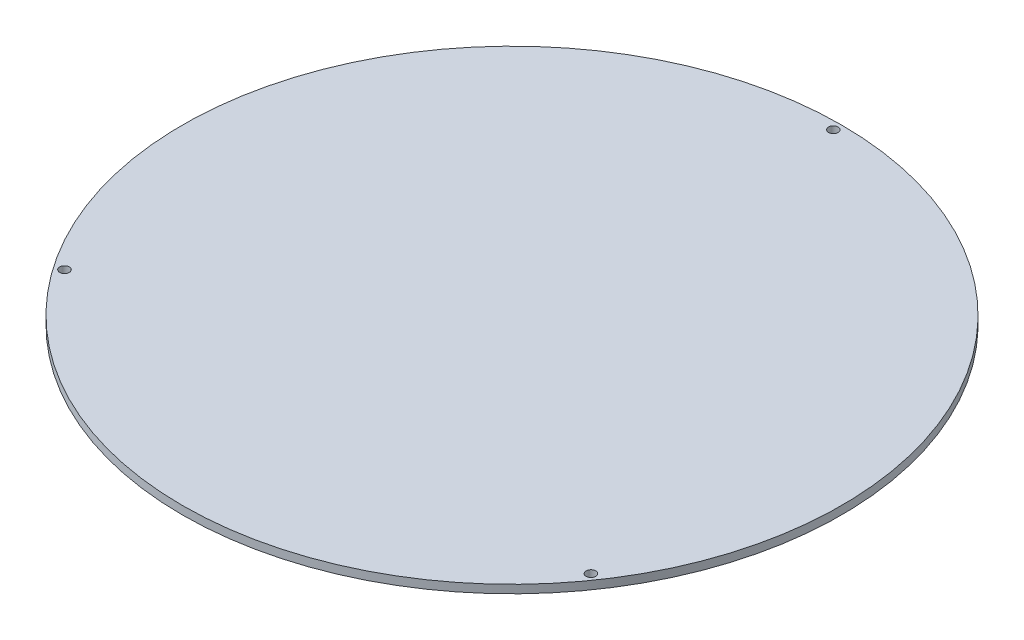
ISO-10303-21;
HEADER;
FILE_DESCRIPTION(('STEP AP214'),'2;1');
FILE_NAME('part.step','',(''),(''),'','','');
FILE_SCHEMA(('AUTOMOTIVE_DESIGN { 1 0 10303 214 1 1 1 1 }'));
ENDSEC;
DATA;
#1=APPLICATION_CONTEXT('core data for automotive mechanical design processes');
#2=APPLICATION_PROTOCOL_DEFINITION('international standard','automotive_design',2000,#1);
#3=PRODUCT_CONTEXT('',#1,'mechanical');
#4=PRODUCT('Part','Part','',(#3));
#5=PRODUCT_RELATED_PRODUCT_CATEGORY('part','',(#4));
#6=PRODUCT_DEFINITION_FORMATION('','',#4);
#7=PRODUCT_DEFINITION_CONTEXT('part definition',#1,'design');
#8=PRODUCT_DEFINITION('design','',#6,#7);
#9=PRODUCT_DEFINITION_SHAPE('','',#8);
#10=(LENGTH_UNIT() NAMED_UNIT(*) SI_UNIT(.MILLI.,.METRE.));
#11=(NAMED_UNIT(*) PLANE_ANGLE_UNIT() SI_UNIT($,.RADIAN.));
#12=(NAMED_UNIT(*) SI_UNIT($,.STERADIAN.) SOLID_ANGLE_UNIT());
#13=UNCERTAINTY_MEASURE_WITH_UNIT(LENGTH_MEASURE(1.E-05),#10,'distance_accuracy_value','');
#14=(GEOMETRIC_REPRESENTATION_CONTEXT(3) GLOBAL_UNCERTAINTY_ASSIGNED_CONTEXT((#13)) GLOBAL_UNIT_ASSIGNED_CONTEXT((#10,
#11,#12)) REPRESENTATION_CONTEXT('',''));
#15=CARTESIAN_POINT('',(0.,0.,0.));
#16=DIRECTION('',(0.,0.,1.));
#17=DIRECTION('',(1.,0.,0.));
#18=AXIS2_PLACEMENT_3D('',#15,#16,#17);
#19=CARTESIAN_POINT('',(0.,3.,0.));
#20=DIRECTION('',(0.,-1.,0.));
#21=DIRECTION('',(0.,0.,-1.));
#22=AXIS2_PLACEMENT_3D('',#19,#20,#21);
#23=CYLINDRICAL_SURFACE('',#22,120.);
#24=CARTESIAN_POINT('',(0.,3.,0.));
#25=DIRECTION('',(0.,1.,0.));
#26=DIRECTION('',(0.,0.,1.));
#27=AXIS2_PLACEMENT_3D('',#24,#25,#26);
#28=CIRCLE('',#27,120.);
#29=CARTESIAN_POINT('',(0.,3.,120.));
#30=VERTEX_POINT('',#29);
#31=EDGE_CURVE('E10',#30,#30,#28,.T.);
#32=ORIENTED_EDGE('',*,*,#31,.F.);
#33=EDGE_LOOP('',(#32));
#34=FACE_BOUND('',#33,.T.);
#35=CARTESIAN_POINT('',(0.,0.,0.));
#36=DIRECTION('',(0.,1.,0.));
#37=DIRECTION('',(0.,0.,1.));
#38=AXIS2_PLACEMENT_3D('',#35,#36,#37);
#39=CIRCLE('',#38,120.);
#40=CARTESIAN_POINT('',(0.,0.,120.));
#41=VERTEX_POINT('',#40);
#42=EDGE_CURVE('E38',#41,#41,#39,.T.);
#43=ORIENTED_EDGE('',*,*,#42,.T.);
#44=EDGE_LOOP('',(#43));
#45=FACE_BOUND('',#44,.T.);
#46=ADVANCED_FACE('F31',(#34,#45),#23,.T.);
#47=CARTESIAN_POINT('',(0.,3.,0.));
#48=DIRECTION('',(0.,1.,0.));
#49=DIRECTION('',(0.,0.,1.));
#50=AXIS2_PLACEMENT_3D('',#47,#48,#49);
#51=PLANE('',#50);
#52=CARTESIAN_POINT('',(0.,3.,-117.));
#53=DIRECTION('',(0.,1.,0.));
#54=DIRECTION('',(0.,0.,1.));
#55=AXIS2_PLACEMENT_3D('',#52,#53,#54);
#56=CIRCLE('',#55,1.75);
#57=CARTESIAN_POINT('',(0.,3.,-115.25));
#58=VERTEX_POINT('',#57);
#59=EDGE_CURVE('E51',#58,#58,#56,.T.);
#60=ORIENTED_EDGE('',*,*,#59,.F.);
#61=EDGE_LOOP('',(#60));
#62=FACE_BOUND('',#61,.T.);
#63=CARTESIAN_POINT('',(-95.8407891818117,3.,67.1084430530729));
#64=DIRECTION('',(0.,1.,0.));
#65=DIRECTION('',(0.,0.,1.));
#66=AXIS2_PLACEMENT_3D('',#63,#64,#65);
#67=CIRCLE('',#66,1.75);
#68=CARTESIAN_POINT('',(-95.8407891818117,3.,68.8584430530729));
#69=VERTEX_POINT('',#68);
#70=EDGE_CURVE('E98',#69,#69,#67,.T.);
#71=ORIENTED_EDGE('',*,*,#70,.F.);
#72=EDGE_LOOP('',(#71));
#73=FACE_BOUND('',#72,.T.);
#74=CARTESIAN_POINT('',(95.8407891818117,3.,67.1084430530729));
#75=DIRECTION('',(0.,1.,0.));
#76=DIRECTION('',(0.,0.,1.));
#77=AXIS2_PLACEMENT_3D('',#74,#75,#76);
#78=CIRCLE('',#77,1.75);
#79=CARTESIAN_POINT('',(95.8407891818117,3.,68.8584430530729));
#80=VERTEX_POINT('',#79);
#81=EDGE_CURVE('E45',#80,#80,#78,.T.);
#82=ORIENTED_EDGE('',*,*,#81,.F.);
#83=EDGE_LOOP('',(#82));
#84=FACE_BOUND('',#83,.T.);
#85=ORIENTED_EDGE('',*,*,#31,.T.);
#86=EDGE_LOOP('',(#85));
#87=FACE_BOUND('',#86,.T.);
#88=ADVANCED_FACE('F73',(#62,#73,#84,#87),#51,.T.);
#89=CARTESIAN_POINT('',(0.,0.,0.));
#90=DIRECTION('',(0.,1.,0.));
#91=DIRECTION('',(0.,0.,1.));
#92=AXIS2_PLACEMENT_3D('',#89,#90,#91);
#93=PLANE('',#92);
#94=CARTESIAN_POINT('',(0.,0.,-117.));
#95=DIRECTION('',(0.,1.,0.));
#96=DIRECTION('',(0.,0.,1.));
#97=AXIS2_PLACEMENT_3D('',#94,#95,#96);
#98=CIRCLE('',#97,1.75);
#99=CARTESIAN_POINT('',(0.,0.,-115.25));
#100=VERTEX_POINT('',#99);
#101=EDGE_CURVE('E34',#100,#100,#98,.T.);
#102=ORIENTED_EDGE('',*,*,#101,.T.);
#103=EDGE_LOOP('',(#102));
#104=FACE_BOUND('',#103,.T.);
#105=CARTESIAN_POINT('',(-95.8407891818117,0.,67.1084430530729));
#106=DIRECTION('',(0.,1.,0.));
#107=DIRECTION('',(0.,0.,1.));
#108=AXIS2_PLACEMENT_3D('',#105,#106,#107);
#109=CIRCLE('',#108,1.75);
#110=CARTESIAN_POINT('',(-95.8407891818117,0.,68.8584430530729));
#111=VERTEX_POINT('',#110);
#112=EDGE_CURVE('E50',#111,#111,#109,.T.);
#113=ORIENTED_EDGE('',*,*,#112,.T.);
#114=EDGE_LOOP('',(#113));
#115=FACE_BOUND('',#114,.T.);
#116=CARTESIAN_POINT('',(95.8407891818117,0.,67.1084430530729));
#117=DIRECTION('',(0.,1.,0.));
#118=DIRECTION('',(0.,0.,1.));
#119=AXIS2_PLACEMENT_3D('',#116,#117,#118);
#120=CIRCLE('',#119,1.75);
#121=CARTESIAN_POINT('',(95.8407891818117,0.,68.8584430530729));
#122=VERTEX_POINT('',#121);
#123=EDGE_CURVE('E48',#122,#122,#120,.T.);
#124=ORIENTED_EDGE('',*,*,#123,.T.);
#125=EDGE_LOOP('',(#124));
#126=FACE_BOUND('',#125,.T.);
#127=ORIENTED_EDGE('',*,*,#42,.F.);
#128=EDGE_LOOP('',(#127));
#129=FACE_BOUND('',#128,.T.);
#130=ADVANCED_FACE('F58',(#104,#115,#126,#129),#93,.F.);
#131=CARTESIAN_POINT('',(95.8407891818117,-1.2E-05,67.1084430530729));
#132=DIRECTION('',(0.,1.,0.));
#133=DIRECTION('',(0.,0.,1.));
#134=AXIS2_PLACEMENT_3D('',#131,#132,#133);
#135=CYLINDRICAL_SURFACE('',#134,1.75);
#136=CARTESIAN_POINT('',(95.8407891818117,3.,68.8584430530729));
#137=CARTESIAN_POINT('',(95.8407891818117,2.96875,68.8584430530729));
#138=CARTESIAN_POINT('',(95.8407891818117,2.9375,68.8584430530729));
#139=CARTESIAN_POINT('',(95.8407891818117,2.875,68.8584430530729));
#140=CARTESIAN_POINT('',(95.8407891818117,2.84375,68.8584430530729));
#141=CARTESIAN_POINT('',(95.8407891818117,2.78125,68.8584430530729));
#142=CARTESIAN_POINT('',(95.8407891818117,2.75,68.8584430530729));
#143=CARTESIAN_POINT('',(95.8407891818117,2.6875,68.8584430530729));
#144=CARTESIAN_POINT('',(95.8407891818117,2.65625,68.8584430530729));
#145=CARTESIAN_POINT('',(95.8407891818117,2.59375,68.8584430530729));
#146=CARTESIAN_POINT('',(95.8407891818117,2.5625,68.8584430530729));
#147=CARTESIAN_POINT('',(95.8407891818117,2.5,68.8584430530729));
#148=CARTESIAN_POINT('',(95.8407891818117,2.46875,68.8584430530729));
#149=CARTESIAN_POINT('',(95.8407891818117,2.40625,68.8584430530729));
#150=CARTESIAN_POINT('',(95.8407891818117,2.375,68.8584430530729));
#151=CARTESIAN_POINT('',(95.8407891818117,2.3125,68.8584430530729));
#152=CARTESIAN_POINT('',(95.8407891818117,2.28125,68.8584430530729));
#153=CARTESIAN_POINT('',(95.8407891818117,2.21875,68.8584430530729));
#154=CARTESIAN_POINT('',(95.8407891818117,2.1875,68.8584430530729));
#155=CARTESIAN_POINT('',(95.8407891818117,2.125,68.8584430530729));
#156=CARTESIAN_POINT('',(95.8407891818117,2.09375,68.8584430530729));
#157=CARTESIAN_POINT('',(95.8407891818117,2.03125,68.8584430530729));
#158=CARTESIAN_POINT('',(95.8407891818117,2.,68.8584430530729));
#159=CARTESIAN_POINT('',(95.8407891818117,1.9375,68.8584430530729));
#160=CARTESIAN_POINT('',(95.8407891818117,1.90625,68.8584430530729));
#161=CARTESIAN_POINT('',(95.8407891818117,1.84375,68.8584430530729));
#162=CARTESIAN_POINT('',(95.8407891818117,1.8125,68.8584430530729));
#163=CARTESIAN_POINT('',(95.8407891818117,1.75,68.8584430530729));
#164=CARTESIAN_POINT('',(95.8407891818117,1.71875,68.8584430530729));
#165=CARTESIAN_POINT('',(95.8407891818117,1.65625,68.8584430530729));
#166=CARTESIAN_POINT('',(95.8407891818117,1.625,68.8584430530729));
#167=CARTESIAN_POINT('',(95.8407891818117,1.5625,68.8584430530729));
#168=CARTESIAN_POINT('',(95.8407891818117,1.53125,68.8584430530729));
#169=CARTESIAN_POINT('',(95.8407891818117,1.46875,68.8584430530729));
#170=CARTESIAN_POINT('',(95.8407891818117,1.4375,68.8584430530729));
#171=CARTESIAN_POINT('',(95.8407891818117,1.375,68.8584430530729));
#172=CARTESIAN_POINT('',(95.8407891818117,1.34375,68.8584430530729));
#173=CARTESIAN_POINT('',(95.8407891818117,1.28125,68.8584430530729));
#174=CARTESIAN_POINT('',(95.8407891818117,1.25,68.8584430530729));
#175=CARTESIAN_POINT('',(95.8407891818117,1.1875,68.8584430530729));
#176=CARTESIAN_POINT('',(95.8407891818117,1.15625,68.8584430530729));
#177=CARTESIAN_POINT('',(95.8407891818117,1.09375,68.8584430530729));
#178=CARTESIAN_POINT('',(95.8407891818117,1.0625,68.8584430530729));
#179=CARTESIAN_POINT('',(95.8407891818117,1.,68.8584430530729));
#180=CARTESIAN_POINT('',(95.8407891818117,0.96875,68.8584430530729));
#181=CARTESIAN_POINT('',(95.8407891818117,0.90625,68.8584430530729));
#182=CARTESIAN_POINT('',(95.8407891818117,0.875,68.8584430530729));
#183=CARTESIAN_POINT('',(95.8407891818117,0.8125,68.8584430530729));
#184=CARTESIAN_POINT('',(95.8407891818117,0.78125,68.8584430530729));
#185=CARTESIAN_POINT('',(95.8407891818117,0.71875,68.8584430530729));
#186=CARTESIAN_POINT('',(95.8407891818117,0.6875,68.8584430530729));
#187=CARTESIAN_POINT('',(95.8407891818117,0.625,68.8584430530729));
#188=CARTESIAN_POINT('',(95.8407891818117,0.59375,68.8584430530729));
#189=CARTESIAN_POINT('',(95.8407891818117,0.53125,68.8584430530729));
#190=CARTESIAN_POINT('',(95.8407891818117,0.5,68.8584430530729));
#191=CARTESIAN_POINT('',(95.8407891818117,0.4375,68.8584430530729));
#192=CARTESIAN_POINT('',(95.8407891818117,0.40625,68.8584430530729));
#193=CARTESIAN_POINT('',(95.8407891818117,0.34375,68.8584430530729));
#194=CARTESIAN_POINT('',(95.8407891818117,0.3125,68.8584430530729));
#195=CARTESIAN_POINT('',(95.8407891818117,0.25,68.8584430530729));
#196=CARTESIAN_POINT('',(95.8407891818117,0.21875,68.8584430530729));
#197=CARTESIAN_POINT('',(95.8407891818117,0.15625,68.8584430530729));
#198=CARTESIAN_POINT('',(95.8407891818117,0.125,68.8584430530729));
#199=CARTESIAN_POINT('',(95.8407891818117,0.0625000000000002,68.8584430530729));
#200=CARTESIAN_POINT('',(95.8407891818117,0.0312500000000002,68.8584430530729));
#201=CARTESIAN_POINT('',(95.8407891818117,0.,68.8584430530729));
#202=B_SPLINE_CURVE_WITH_KNOTS('',3,(#136,#137,#138,#139,#140,#141,#142,#143,#144,#145,#146,
#147,#148,#149,#150,#151,#152,#153,#154,#155,#156,#157,#158,#159,#160,#161,#162,#163,#164,#165,
#166,#167,#168,#169,#170,#171,#172,#173,#174,#175,#176,#177,#178,#179,#180,#181,#182,#183,#184,
#185,#186,#187,#188,#189,#190,#191,#192,#193,#194,#195,#196,#197,#198,#199,#200,#201),
.UNSPECIFIED.,.F.,.F.,(4,2,2,2,2,2,2,2,2,2,2,2,2,2,2,2,2,2,2,2,2,2,2,2,2,2,2,2,2,2,2,2,4),(0.,
0.0937500000000001,0.1875,0.28125,0.375,0.46875,0.5625,0.65625,0.75,0.84375,0.9375,1.03125,
1.125,1.21875,1.3125,1.40625,1.5,1.59375,1.6875,1.78125,1.875,1.96875,2.0625,2.15625,2.25,
2.34375,2.4375,2.53125,2.625,2.71875,2.8125,2.90625,3.),.UNSPECIFIED.);
#203=EDGE_CURVE('BSEAM68',#80,#122,#202,.T.);
#204=ORIENTED_EDGE('',*,*,#81,.T.);
#205=ORIENTED_EDGE('',*,*,#123,.F.);
#206=ORIENTED_EDGE('',*,*,#203,.T.);
#207=ORIENTED_EDGE('',*,*,#203,.F.);
#208=EDGE_LOOP('',(#204,#206,#205,#207));
#209=FACE_BOUND('',#208,.T.);
#210=ADVANCED_FACE('F68',(#209),#135,.F.);
#211=CARTESIAN_POINT('',(-95.8407891818117,-1.2E-05,67.1084430530729));
#212=DIRECTION('',(0.,1.,0.));
#213=DIRECTION('',(0.,0.,1.));
#214=AXIS2_PLACEMENT_3D('',#211,#212,#213);
#215=CYLINDRICAL_SURFACE('',#214,1.75);
#216=CARTESIAN_POINT('',(-95.8407891818117,3.,68.8584430530729));
#217=CARTESIAN_POINT('',(-95.8407891818117,2.96875,68.8584430530729));
#218=CARTESIAN_POINT('',(-95.8407891818117,2.9375,68.8584430530729));
#219=CARTESIAN_POINT('',(-95.8407891818117,2.875,68.8584430530729));
#220=CARTESIAN_POINT('',(-95.8407891818117,2.84375,68.8584430530729));
#221=CARTESIAN_POINT('',(-95.8407891818117,2.78125,68.8584430530729));
#222=CARTESIAN_POINT('',(-95.8407891818117,2.75,68.8584430530729));
#223=CARTESIAN_POINT('',(-95.8407891818117,2.6875,68.8584430530729));
#224=CARTESIAN_POINT('',(-95.8407891818117,2.65625,68.8584430530729));
#225=CARTESIAN_POINT('',(-95.8407891818117,2.59375,68.8584430530729));
#226=CARTESIAN_POINT('',(-95.8407891818117,2.5625,68.8584430530729));
#227=CARTESIAN_POINT('',(-95.8407891818117,2.5,68.8584430530729));
#228=CARTESIAN_POINT('',(-95.8407891818117,2.46875,68.8584430530729));
#229=CARTESIAN_POINT('',(-95.8407891818117,2.40625,68.8584430530729));
#230=CARTESIAN_POINT('',(-95.8407891818117,2.375,68.8584430530729));
#231=CARTESIAN_POINT('',(-95.8407891818117,2.3125,68.8584430530729));
#232=CARTESIAN_POINT('',(-95.8407891818117,2.28125,68.8584430530729));
#233=CARTESIAN_POINT('',(-95.8407891818117,2.21875,68.8584430530729));
#234=CARTESIAN_POINT('',(-95.8407891818117,2.1875,68.8584430530729));
#235=CARTESIAN_POINT('',(-95.8407891818117,2.125,68.8584430530729));
#236=CARTESIAN_POINT('',(-95.8407891818117,2.09375,68.8584430530729));
#237=CARTESIAN_POINT('',(-95.8407891818117,2.03125,68.8584430530729));
#238=CARTESIAN_POINT('',(-95.8407891818117,2.,68.8584430530729));
#239=CARTESIAN_POINT('',(-95.8407891818117,1.9375,68.8584430530729));
#240=CARTESIAN_POINT('',(-95.8407891818117,1.90625,68.8584430530729));
#241=CARTESIAN_POINT('',(-95.8407891818117,1.84375,68.8584430530729));
#242=CARTESIAN_POINT('',(-95.8407891818117,1.8125,68.8584430530729));
#243=CARTESIAN_POINT('',(-95.8407891818117,1.75,68.8584430530729));
#244=CARTESIAN_POINT('',(-95.8407891818117,1.71875,68.8584430530729));
#245=CARTESIAN_POINT('',(-95.8407891818117,1.65625,68.8584430530729));
#246=CARTESIAN_POINT('',(-95.8407891818117,1.625,68.8584430530729));
#247=CARTESIAN_POINT('',(-95.8407891818117,1.5625,68.8584430530729));
#248=CARTESIAN_POINT('',(-95.8407891818117,1.53125,68.8584430530729));
#249=CARTESIAN_POINT('',(-95.8407891818117,1.46875,68.8584430530729));
#250=CARTESIAN_POINT('',(-95.8407891818117,1.4375,68.8584430530729));
#251=CARTESIAN_POINT('',(-95.8407891818117,1.375,68.8584430530729));
#252=CARTESIAN_POINT('',(-95.8407891818117,1.34375,68.8584430530729));
#253=CARTESIAN_POINT('',(-95.8407891818117,1.28125,68.8584430530729));
#254=CARTESIAN_POINT('',(-95.8407891818117,1.25,68.8584430530729));
#255=CARTESIAN_POINT('',(-95.8407891818117,1.1875,68.8584430530729));
#256=CARTESIAN_POINT('',(-95.8407891818117,1.15625,68.8584430530729));
#257=CARTESIAN_POINT('',(-95.8407891818117,1.09375,68.8584430530729));
#258=CARTESIAN_POINT('',(-95.8407891818117,1.0625,68.8584430530729));
#259=CARTESIAN_POINT('',(-95.8407891818117,1.,68.8584430530729));
#260=CARTESIAN_POINT('',(-95.8407891818117,0.96875,68.8584430530729));
#261=CARTESIAN_POINT('',(-95.8407891818117,0.90625,68.8584430530729));
#262=CARTESIAN_POINT('',(-95.8407891818117,0.875,68.8584430530729));
#263=CARTESIAN_POINT('',(-95.8407891818117,0.8125,68.8584430530729));
#264=CARTESIAN_POINT('',(-95.8407891818117,0.78125,68.8584430530729));
#265=CARTESIAN_POINT('',(-95.8407891818117,0.71875,68.8584430530729));
#266=CARTESIAN_POINT('',(-95.8407891818117,0.6875,68.8584430530729));
#267=CARTESIAN_POINT('',(-95.8407891818117,0.625,68.8584430530729));
#268=CARTESIAN_POINT('',(-95.8407891818117,0.59375,68.8584430530729));
#269=CARTESIAN_POINT('',(-95.8407891818117,0.53125,68.8584430530729));
#270=CARTESIAN_POINT('',(-95.8407891818117,0.5,68.8584430530729));
#271=CARTESIAN_POINT('',(-95.8407891818117,0.4375,68.8584430530729));
#272=CARTESIAN_POINT('',(-95.8407891818117,0.40625,68.8584430530729));
#273=CARTESIAN_POINT('',(-95.8407891818117,0.34375,68.8584430530729));
#274=CARTESIAN_POINT('',(-95.8407891818117,0.3125,68.8584430530729));
#275=CARTESIAN_POINT('',(-95.8407891818117,0.25,68.8584430530729));
#276=CARTESIAN_POINT('',(-95.8407891818117,0.21875,68.8584430530729));
#277=CARTESIAN_POINT('',(-95.8407891818117,0.15625,68.8584430530729));
#278=CARTESIAN_POINT('',(-95.8407891818117,0.125,68.8584430530729));
#279=CARTESIAN_POINT('',(-95.8407891818117,0.0625000000000002,68.8584430530729));
#280=CARTESIAN_POINT('',(-95.8407891818117,0.0312500000000002,68.8584430530729));
#281=CARTESIAN_POINT('',(-95.8407891818117,0.,68.8584430530729));
#282=B_SPLINE_CURVE_WITH_KNOTS('',3,(#216,#217,#218,#219,#220,#221,#222,#223,#224,#225,#226,
#227,#228,#229,#230,#231,#232,#233,#234,#235,#236,#237,#238,#239,#240,#241,#242,#243,#244,#245,
#246,#247,#248,#249,#250,#251,#252,#253,#254,#255,#256,#257,#258,#259,#260,#261,#262,#263,#264,
#265,#266,#267,#268,#269,#270,#271,#272,#273,#274,#275,#276,#277,#278,#279,#280,#281),
.UNSPECIFIED.,.F.,.F.,(4,2,2,2,2,2,2,2,2,2,2,2,2,2,2,2,2,2,2,2,2,2,2,2,2,2,2,2,2,2,2,2,4),(0.,
0.0937500000000001,0.1875,0.28125,0.375,0.46875,0.5625,0.65625,0.75,0.84375,0.9375,1.03125,
1.125,1.21875,1.3125,1.40625,1.5,1.59375,1.6875,1.78125,1.875,1.96875,2.0625,2.15625,2.25,
2.34375,2.4375,2.53125,2.625,2.71875,2.8125,2.90625,3.),.UNSPECIFIED.);
#283=EDGE_CURVE('BSEAM62',#69,#111,#282,.T.);
#284=ORIENTED_EDGE('',*,*,#70,.T.);
#285=ORIENTED_EDGE('',*,*,#112,.F.);
#286=ORIENTED_EDGE('',*,*,#283,.T.);
#287=ORIENTED_EDGE('',*,*,#283,.F.);
#288=EDGE_LOOP('',(#284,#286,#285,#287));
#289=FACE_BOUND('',#288,.T.);
#290=ADVANCED_FACE('F62',(#289),#215,.F.);
#291=CARTESIAN_POINT('',(0.,-1.2E-05,-117.));
#292=DIRECTION('',(0.,1.,0.));
#293=DIRECTION('',(0.,0.,1.));
#294=AXIS2_PLACEMENT_3D('',#291,#292,#293);
#295=CYLINDRICAL_SURFACE('',#294,1.75);
#296=CARTESIAN_POINT('',(0.,3.,-115.25));
#297=CARTESIAN_POINT('',(0.,2.96875,-115.25));
#298=CARTESIAN_POINT('',(0.,2.9375,-115.25));
#299=CARTESIAN_POINT('',(0.,2.875,-115.25));
#300=CARTESIAN_POINT('',(0.,2.84375,-115.25));
#301=CARTESIAN_POINT('',(0.,2.78125,-115.25));
#302=CARTESIAN_POINT('',(0.,2.75,-115.25));
#303=CARTESIAN_POINT('',(0.,2.6875,-115.25));
#304=CARTESIAN_POINT('',(0.,2.65625,-115.25));
#305=CARTESIAN_POINT('',(0.,2.59375,-115.25));
#306=CARTESIAN_POINT('',(0.,2.5625,-115.25));
#307=CARTESIAN_POINT('',(0.,2.5,-115.25));
#308=CARTESIAN_POINT('',(0.,2.46875,-115.25));
#309=CARTESIAN_POINT('',(0.,2.40625,-115.25));
#310=CARTESIAN_POINT('',(0.,2.375,-115.25));
#311=CARTESIAN_POINT('',(0.,2.3125,-115.25));
#312=CARTESIAN_POINT('',(0.,2.28125,-115.25));
#313=CARTESIAN_POINT('',(0.,2.21875,-115.25));
#314=CARTESIAN_POINT('',(0.,2.1875,-115.25));
#315=CARTESIAN_POINT('',(0.,2.125,-115.25));
#316=CARTESIAN_POINT('',(0.,2.09375,-115.25));
#317=CARTESIAN_POINT('',(0.,2.03125,-115.25));
#318=CARTESIAN_POINT('',(0.,2.,-115.25));
#319=CARTESIAN_POINT('',(0.,1.9375,-115.25));
#320=CARTESIAN_POINT('',(0.,1.90625,-115.25));
#321=CARTESIAN_POINT('',(0.,1.84375,-115.25));
#322=CARTESIAN_POINT('',(0.,1.8125,-115.25));
#323=CARTESIAN_POINT('',(0.,1.75,-115.25));
#324=CARTESIAN_POINT('',(0.,1.71875,-115.25));
#325=CARTESIAN_POINT('',(0.,1.65625,-115.25));
#326=CARTESIAN_POINT('',(0.,1.625,-115.25));
#327=CARTESIAN_POINT('',(0.,1.5625,-115.25));
#328=CARTESIAN_POINT('',(0.,1.53125,-115.25));
#329=CARTESIAN_POINT('',(0.,1.46875,-115.25));
#330=CARTESIAN_POINT('',(0.,1.4375,-115.25));
#331=CARTESIAN_POINT('',(0.,1.375,-115.25));
#332=CARTESIAN_POINT('',(0.,1.34375,-115.25));
#333=CARTESIAN_POINT('',(0.,1.28125,-115.25));
#334=CARTESIAN_POINT('',(0.,1.25,-115.25));
#335=CARTESIAN_POINT('',(0.,1.1875,-115.25));
#336=CARTESIAN_POINT('',(0.,1.15625,-115.25));
#337=CARTESIAN_POINT('',(0.,1.09375,-115.25));
#338=CARTESIAN_POINT('',(0.,1.0625,-115.25));
#339=CARTESIAN_POINT('',(0.,1.,-115.25));
#340=CARTESIAN_POINT('',(0.,0.96875,-115.25));
#341=CARTESIAN_POINT('',(0.,0.90625,-115.25));
#342=CARTESIAN_POINT('',(0.,0.875,-115.25));
#343=CARTESIAN_POINT('',(0.,0.8125,-115.25));
#344=CARTESIAN_POINT('',(0.,0.78125,-115.25));
#345=CARTESIAN_POINT('',(0.,0.71875,-115.25));
#346=CARTESIAN_POINT('',(0.,0.6875,-115.25));
#347=CARTESIAN_POINT('',(0.,0.625,-115.25));
#348=CARTESIAN_POINT('',(0.,0.59375,-115.25));
#349=CARTESIAN_POINT('',(0.,0.53125,-115.25));
#350=CARTESIAN_POINT('',(0.,0.5,-115.25));
#351=CARTESIAN_POINT('',(0.,0.4375,-115.25));
#352=CARTESIAN_POINT('',(0.,0.40625,-115.25));
#353=CARTESIAN_POINT('',(0.,0.34375,-115.25));
#354=CARTESIAN_POINT('',(0.,0.3125,-115.25));
#355=CARTESIAN_POINT('',(0.,0.25,-115.25));
#356=CARTESIAN_POINT('',(0.,0.21875,-115.25));
#357=CARTESIAN_POINT('',(0.,0.15625,-115.25));
#358=CARTESIAN_POINT('',(0.,0.125,-115.25));
#359=CARTESIAN_POINT('',(0.,0.0625000000000002,-115.25));
#360=CARTESIAN_POINT('',(0.,0.0312500000000002,-115.25));
#361=CARTESIAN_POINT('',(0.,0.,-115.25));
#362=B_SPLINE_CURVE_WITH_KNOTS('',3,(#296,#297,#298,#299,#300,#301,#302,#303,#304,#305,#306,
#307,#308,#309,#310,#311,#312,#313,#314,#315,#316,#317,#318,#319,#320,#321,#322,#323,#324,#325,
#326,#327,#328,#329,#330,#331,#332,#333,#334,#335,#336,#337,#338,#339,#340,#341,#342,#343,#344,
#345,#346,#347,#348,#349,#350,#351,#352,#353,#354,#355,#356,#357,#358,#359,#360,#361),
.UNSPECIFIED.,.F.,.F.,(4,2,2,2,2,2,2,2,2,2,2,2,2,2,2,2,2,2,2,2,2,2,2,2,2,2,2,2,2,2,2,2,4),(0.,
0.0937500000000001,0.1875,0.28125,0.375,0.46875,0.5625,0.65625,0.75,0.84375,0.9375,1.03125,
1.125,1.21875,1.3125,1.40625,1.5,1.59375,1.6875,1.78125,1.875,1.96875,2.0625,2.15625,2.25,
2.34375,2.4375,2.53125,2.625,2.71875,2.8125,2.90625,3.),.UNSPECIFIED.);
#363=EDGE_CURVE('BSEAM60',#58,#100,#362,.T.);
#364=ORIENTED_EDGE('',*,*,#59,.T.);
#365=ORIENTED_EDGE('',*,*,#101,.F.);
#366=ORIENTED_EDGE('',*,*,#363,.T.);
#367=ORIENTED_EDGE('',*,*,#363,.F.);
#368=EDGE_LOOP('',(#364,#366,#365,#367));
#369=FACE_BOUND('',#368,.T.);
#370=ADVANCED_FACE('F60',(#369),#295,.F.);
#371=CLOSED_SHELL('',(#46,#88,#130,#210,#290,#370));
#372=MANIFOLD_SOLID_BREP('B2',#371);
#373=ADVANCED_BREP_SHAPE_REPRESENTATION('',(#18,#372),#14);
#374=SHAPE_DEFINITION_REPRESENTATION(#9,#373);
ENDSEC;
END-ISO-10303-21;
